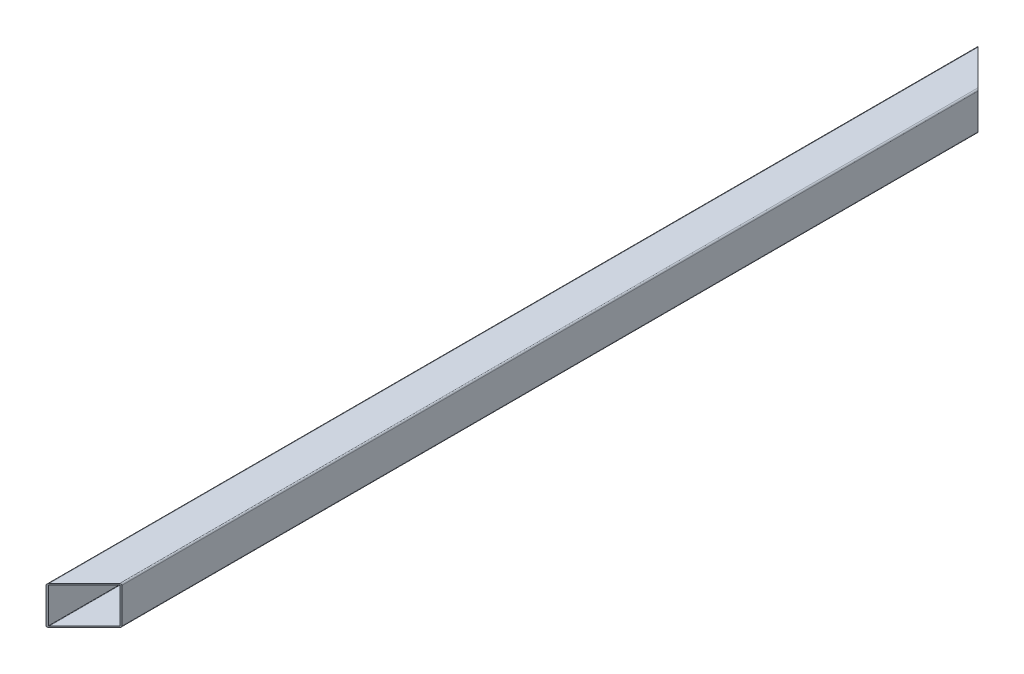
ISO-10303-21;
HEADER;
FILE_DESCRIPTION(('STEP AP214'),'2;1');
FILE_NAME('part.step','',(''),(''),'','','');
FILE_SCHEMA(('AUTOMOTIVE_DESIGN { 1 0 10303 214 1 1 1 1 }'));
ENDSEC;
DATA;
#1=APPLICATION_CONTEXT('core data for automotive mechanical design processes');
#2=APPLICATION_PROTOCOL_DEFINITION('international standard','automotive_design',2000,#1);
#3=PRODUCT_CONTEXT('',#1,'mechanical');
#4=PRODUCT('Part','Part','',(#3));
#5=PRODUCT_RELATED_PRODUCT_CATEGORY('part','',(#4));
#6=PRODUCT_DEFINITION_FORMATION('','',#4);
#7=PRODUCT_DEFINITION_CONTEXT('part definition',#1,'design');
#8=PRODUCT_DEFINITION('design','',#6,#7);
#9=PRODUCT_DEFINITION_SHAPE('','',#8);
#10=(LENGTH_UNIT() NAMED_UNIT(*) SI_UNIT(.MILLI.,.METRE.));
#11=(NAMED_UNIT(*) PLANE_ANGLE_UNIT() SI_UNIT($,.RADIAN.));
#12=(NAMED_UNIT(*) SI_UNIT($,.STERADIAN.) SOLID_ANGLE_UNIT());
#13=UNCERTAINTY_MEASURE_WITH_UNIT(LENGTH_MEASURE(1.E-05),#10,'distance_accuracy_value','');
#14=(GEOMETRIC_REPRESENTATION_CONTEXT(3) GLOBAL_UNCERTAINTY_ASSIGNED_CONTEXT((#13)) GLOBAL_UNIT_ASSIGNED_CONTEXT((#10,
#11,#12)) REPRESENTATION_CONTEXT('',''));
#15=CARTESIAN_POINT('',(0.,0.,0.));
#16=DIRECTION('',(0.,0.,1.));
#17=DIRECTION('',(1.,0.,0.));
#18=AXIS2_PLACEMENT_3D('',#15,#16,#17);
#19=CARTESIAN_POINT('',(-18.5,18.5,-980.));
#20=DIRECTION('',(0.,0.,1.));
#21=DIRECTION('',(1.,0.,0.));
#22=AXIS2_PLACEMENT_3D('',#19,#20,#21);
#23=CYLINDRICAL_SURFACE('',#22,1.5);
#24=DIRECTION('',(0.,0.,1.));
#25=VECTOR('',#24,1.);
#26=CARTESIAN_POINT('',(-20.,18.5,-980.));
#27=LINE('',#26,#25);
#28=CARTESIAN_POINT('',(-20.,18.5,-980.));
#29=VERTEX_POINT('',#28);
#30=CARTESIAN_POINT('',(-20.,18.5,0.));
#31=VERTEX_POINT('',#30);
#32=EDGE_CURVE('E231',#29,#31,#27,.T.);
#33=ORIENTED_EDGE('',*,*,#32,.T.);
#34=CARTESIAN_POINT('',(-18.5,18.5,-1.50000000000017));
#35=DIRECTION('',(-0.707106781186559,0.,-0.707106781186536));
#36=DIRECTION('',(-0.707106781186536,0.,0.707106781186559));
#37=AXIS2_PLACEMENT_3D('',#34,#35,#36);
#38=ELLIPSE('',#37,2.12132034355967,1.5);
#39=CARTESIAN_POINT('',(-18.4999999999999,20.,-1.50000000000016));
#40=VERTEX_POINT('',#39);
#41=EDGE_CURVE('E188',#31,#40,#38,.T.);
#42=ORIENTED_EDGE('',*,*,#41,.T.);
#43=DIRECTION('',(0.,0.,1.));
#44=VECTOR('',#43,1.);
#45=CARTESIAN_POINT('',(-18.5,20.,-980.));
#46=LINE('',#45,#44);
#47=CARTESIAN_POINT('',(-18.5,20.,-978.5));
#48=VERTEX_POINT('',#47);
#49=EDGE_CURVE('E12',#48,#40,#46,.T.);
#50=ORIENTED_EDGE('',*,*,#49,.F.);
#51=CARTESIAN_POINT('',(-18.5,18.5,-978.5));
#52=DIRECTION('',(-0.707106781186559,0.,0.707106781186536));
#53=DIRECTION('',(0.707106781186536,0.,0.707106781186559));
#54=AXIS2_PLACEMENT_3D('',#51,#52,#53);
#55=ELLIPSE('',#54,2.12132034355967,1.5);
#56=EDGE_CURVE('E298',#48,#29,#55,.T.);
#57=ORIENTED_EDGE('',*,*,#56,.T.);
#58=EDGE_LOOP('',(#33,#42,#50,#57));
#59=FACE_BOUND('',#58,.T.);
#60=ADVANCED_FACE('F63',(#59),#23,.T.);
#61=CARTESIAN_POINT('',(-18.5,20.,-980.));
#62=DIRECTION('',(0.,-1.,0.));
#63=DIRECTION('',(0.,0.,-1.));
#64=AXIS2_PLACEMENT_3D('',#61,#62,#63);
#65=PLANE('',#64);
#66=ORIENTED_EDGE('',*,*,#49,.T.);
#67=DIRECTION('',(-0.707106781186536,0.,0.707106781186559));
#68=VECTOR('',#67,1.);
#69=CARTESIAN_POINT('',(-20.,20.,0.));
#70=LINE('',#69,#68);
#71=CARTESIAN_POINT('',(18.5,20.,-38.5000000000012));
#72=VERTEX_POINT('',#71);
#73=EDGE_CURVE('E180',#72,#40,#70,.T.);
#74=ORIENTED_EDGE('',*,*,#73,.F.);
#75=DIRECTION('',(0.,0.,1.));
#76=VECTOR('',#75,1.);
#77=CARTESIAN_POINT('',(18.5,20.,-980.));
#78=LINE('',#77,#76);
#79=CARTESIAN_POINT('',(18.5,20.,-941.499999999999));
#80=VERTEX_POINT('',#79);
#81=EDGE_CURVE('E72',#80,#72,#78,.T.);
#82=ORIENTED_EDGE('',*,*,#81,.F.);
#83=DIRECTION('',(0.707106781186536,0.,0.707106781186559));
#84=VECTOR('',#83,1.);
#85=CARTESIAN_POINT('',(-20.,20.,-980.));
#86=LINE('',#85,#84);
#87=EDGE_CURVE('E272',#48,#80,#86,.T.);
#88=ORIENTED_EDGE('',*,*,#87,.F.);
#89=EDGE_LOOP('',(#66,#74,#82,#88));
#90=FACE_BOUND('',#89,.T.);
#91=ADVANCED_FACE('F192',(#90),#65,.F.);
#92=CARTESIAN_POINT('',(18.5,18.5,-980.));
#93=DIRECTION('',(0.,0.,1.));
#94=DIRECTION('',(1.,0.,0.));
#95=AXIS2_PLACEMENT_3D('',#92,#93,#94);
#96=CYLINDRICAL_SURFACE('',#95,1.5);
#97=ORIENTED_EDGE('',*,*,#81,.T.);
#98=CARTESIAN_POINT('',(18.5,18.5,-38.5000000000013));
#99=DIRECTION('',(-0.707106781186559,0.,-0.707106781186536));
#100=DIRECTION('',(-0.707106781186536,0.,0.707106781186559));
#101=AXIS2_PLACEMENT_3D('',#98,#99,#100);
#102=ELLIPSE('',#101,2.12132034355967,1.5);
#103=CARTESIAN_POINT('',(20.,18.5,-40.0000000000014));
#104=VERTEX_POINT('',#103);
#105=EDGE_CURVE('E177',#72,#104,#102,.T.);
#106=ORIENTED_EDGE('',*,*,#105,.T.);
#107=DIRECTION('',(0.,0.,1.));
#108=VECTOR('',#107,1.);
#109=CARTESIAN_POINT('',(20.,18.5,-980.));
#110=LINE('',#109,#108);
#111=CARTESIAN_POINT('',(20.,18.5,-939.999999999999));
#112=VERTEX_POINT('',#111);
#113=EDGE_CURVE('E200',#112,#104,#110,.T.);
#114=ORIENTED_EDGE('',*,*,#113,.F.);
#115=CARTESIAN_POINT('',(18.5,18.5,-941.499999999999));
#116=DIRECTION('',(-0.707106781186559,0.,0.707106781186536));
#117=DIRECTION('',(0.707106781186536,0.,0.707106781186559));
#118=AXIS2_PLACEMENT_3D('',#115,#116,#117);
#119=ELLIPSE('',#118,2.12132034355967,1.5);
#120=EDGE_CURVE('E199',#112,#80,#119,.T.);
#121=ORIENTED_EDGE('',*,*,#120,.T.);
#122=EDGE_LOOP('',(#97,#106,#114,#121));
#123=FACE_BOUND('',#122,.T.);
#124=ADVANCED_FACE('F198',(#123),#96,.T.);
#125=CARTESIAN_POINT('',(20.,-18.5,-980.));
#126=DIRECTION('',(-1.,0.,0.));
#127=DIRECTION('',(0.,0.,1.));
#128=AXIS2_PLACEMENT_3D('',#125,#126,#127);
#129=PLANE('',#128);
#130=ORIENTED_EDGE('',*,*,#113,.T.);
#131=DIRECTION('',(0.,-1.,0.));
#132=VECTOR('',#131,1.);
#133=CARTESIAN_POINT('',(20.,-18.5,-40.0000000000014));
#134=LINE('',#133,#132);
#135=CARTESIAN_POINT('',(20.,-18.5,-40.0000000000014));
#136=VERTEX_POINT('',#135);
#137=EDGE_CURVE('E183',#104,#136,#134,.T.);
#138=ORIENTED_EDGE('',*,*,#137,.T.);
#139=DIRECTION('',(0.,0.,1.));
#140=VECTOR('',#139,1.);
#141=CARTESIAN_POINT('',(20.,-18.5,-980.));
#142=LINE('',#141,#140);
#143=CARTESIAN_POINT('',(20.,-18.5,-939.999999999999));
#144=VERTEX_POINT('',#143);
#145=EDGE_CURVE('E202',#144,#136,#142,.T.);
#146=ORIENTED_EDGE('',*,*,#145,.F.);
#147=DIRECTION('',(0.,1.,0.));
#148=VECTOR('',#147,1.);
#149=CARTESIAN_POINT('',(20.,-18.5,-939.999999999999));
#150=LINE('',#149,#148);
#151=EDGE_CURVE('E265',#144,#112,#150,.T.);
#152=ORIENTED_EDGE('',*,*,#151,.T.);
#153=EDGE_LOOP('',(#130,#138,#146,#152));
#154=FACE_BOUND('',#153,.T.);
#155=ADVANCED_FACE('F264',(#154),#129,.F.);
#156=CARTESIAN_POINT('',(18.5,-18.5,-980.));
#157=DIRECTION('',(0.,0.,1.));
#158=DIRECTION('',(1.,0.,0.));
#159=AXIS2_PLACEMENT_3D('',#156,#157,#158);
#160=CYLINDRICAL_SURFACE('',#159,1.5);
#161=ORIENTED_EDGE('',*,*,#145,.T.);
#162=CARTESIAN_POINT('',(18.5,-18.5,-38.5000000000013));
#163=DIRECTION('',(-0.707106781186559,0.,-0.707106781186536));
#164=DIRECTION('',(-0.707106781186536,0.,0.707106781186559));
#165=AXIS2_PLACEMENT_3D('',#162,#163,#164);
#166=ELLIPSE('',#165,2.12132034355968,1.5);
#167=CARTESIAN_POINT('',(18.5,-20.,-38.5000000000013));
#168=VERTEX_POINT('',#167);
#169=EDGE_CURVE('E260',#136,#168,#166,.T.);
#170=ORIENTED_EDGE('',*,*,#169,.T.);
#171=DIRECTION('',(0.,0.,1.));
#172=VECTOR('',#171,1.);
#173=CARTESIAN_POINT('',(18.5,-20.,-980.));
#174=LINE('',#173,#172);
#175=CARTESIAN_POINT('',(18.5,-20.,-941.499999999999));
#176=VERTEX_POINT('',#175);
#177=EDGE_CURVE('E251',#176,#168,#174,.T.);
#178=ORIENTED_EDGE('',*,*,#177,.F.);
#179=CARTESIAN_POINT('',(18.5,-18.5,-941.499999999999));
#180=DIRECTION('',(-0.707106781186559,0.,0.707106781186536));
#181=DIRECTION('',(0.707106781186536,0.,0.707106781186559));
#182=AXIS2_PLACEMENT_3D('',#179,#180,#181);
#183=ELLIPSE('',#182,2.12132034355968,1.5);
#184=EDGE_CURVE('E261',#176,#144,#183,.T.);
#185=ORIENTED_EDGE('',*,*,#184,.T.);
#186=EDGE_LOOP('',(#161,#170,#178,#185));
#187=FACE_BOUND('',#186,.T.);
#188=ADVANCED_FACE('F258',(#187),#160,.T.);
#189=CARTESIAN_POINT('',(18.5,-20.,-980.));
#190=DIRECTION('',(0.,1.,0.));
#191=DIRECTION('',(0.,0.,1.));
#192=AXIS2_PLACEMENT_3D('',#189,#190,#191);
#193=PLANE('',#192);
#194=ORIENTED_EDGE('',*,*,#177,.T.);
#195=DIRECTION('',(-0.707106781186536,0.,0.707106781186559));
#196=VECTOR('',#195,1.);
#197=CARTESIAN_POINT('',(489.249999999999,-20.,-509.250000000016));
#198=LINE('',#197,#196);
#199=CARTESIAN_POINT('',(-18.5,-20.,-1.50000000000017));
#200=VERTEX_POINT('',#199);
#201=EDGE_CURVE('E267',#168,#200,#198,.T.);
#202=ORIENTED_EDGE('',*,*,#201,.T.);
#203=DIRECTION('',(0.,0.,1.));
#204=VECTOR('',#203,1.);
#205=CARTESIAN_POINT('',(-18.5,-20.,-980.));
#206=LINE('',#205,#204);
#207=CARTESIAN_POINT('',(-18.5,-20.,-978.5));
#208=VERTEX_POINT('',#207);
#209=EDGE_CURVE('E243',#208,#200,#206,.T.);
#210=ORIENTED_EDGE('',*,*,#209,.F.);
#211=DIRECTION('',(0.707106781186536,0.,0.707106781186559));
#212=VECTOR('',#211,1.);
#213=CARTESIAN_POINT('',(-0.750000000000615,-20.,-960.75));
#214=LINE('',#213,#212);
#215=EDGE_CURVE('E292',#208,#176,#214,.T.);
#216=ORIENTED_EDGE('',*,*,#215,.T.);
#217=EDGE_LOOP('',(#194,#202,#210,#216));
#218=FACE_BOUND('',#217,.T.);
#219=ADVANCED_FACE('F345',(#218),#193,.F.);
#220=CARTESIAN_POINT('',(-18.5,-18.5,-980.));
#221=DIRECTION('',(0.,0.,1.));
#222=DIRECTION('',(1.,0.,0.));
#223=AXIS2_PLACEMENT_3D('',#220,#221,#222);
#224=CYLINDRICAL_SURFACE('',#223,1.5);
#225=ORIENTED_EDGE('',*,*,#209,.T.);
#226=CARTESIAN_POINT('',(-18.5,-18.5,-1.50000000000017));
#227=DIRECTION('',(-0.707106781186559,0.,-0.707106781186536));
#228=DIRECTION('',(-0.707106781186536,0.,0.707106781186559));
#229=AXIS2_PLACEMENT_3D('',#226,#227,#228);
#230=ELLIPSE('',#229,2.12132034355968,1.5);
#231=CARTESIAN_POINT('',(-20.,-18.5,0.));
#232=VERTEX_POINT('',#231);
#233=EDGE_CURVE('E306',#200,#232,#230,.T.);
#234=ORIENTED_EDGE('',*,*,#233,.T.);
#235=DIRECTION('',(0.,0.,1.));
#236=VECTOR('',#235,1.);
#237=CARTESIAN_POINT('',(-20.,-18.5,-980.));
#238=LINE('',#237,#236);
#239=CARTESIAN_POINT('',(-20.,-18.5,-980.));
#240=VERTEX_POINT('',#239);
#241=EDGE_CURVE('E237',#240,#232,#238,.T.);
#242=ORIENTED_EDGE('',*,*,#241,.F.);
#243=CARTESIAN_POINT('',(-18.5,-18.5,-978.5));
#244=DIRECTION('',(-0.707106781186559,0.,0.707106781186536));
#245=DIRECTION('',(0.707106781186536,0.,0.707106781186559));
#246=AXIS2_PLACEMENT_3D('',#243,#244,#245);
#247=ELLIPSE('',#246,2.12132034355968,1.5);
#248=EDGE_CURVE('E289',#240,#208,#247,.T.);
#249=ORIENTED_EDGE('',*,*,#248,.T.);
#250=EDGE_LOOP('',(#225,#234,#242,#249));
#251=FACE_BOUND('',#250,.T.);
#252=ADVANCED_FACE('F309',(#251),#224,.T.);
#253=CARTESIAN_POINT('',(18.5,18.5,-980.));
#254=DIRECTION('',(0.,0.,1.));
#255=DIRECTION('',(1.,0.,0.));
#256=AXIS2_PLACEMENT_3D('',#253,#254,#255);
#257=CYLINDRICAL_SURFACE('',#256,0.3);
#258=CARTESIAN_POINT('',(18.5,18.5,-38.5000000000013));
#259=DIRECTION('',(-0.707106781186559,0.,-0.707106781186536));
#260=DIRECTION('',(-0.707106781186536,0.,0.707106781186559));
#261=AXIS2_PLACEMENT_3D('',#258,#259,#260);
#262=ELLIPSE('',#261,0.424264068711935,0.3);
#263=CARTESIAN_POINT('',(18.5,18.8,-38.5000000000014));
#264=VERTEX_POINT('',#263);
#265=CARTESIAN_POINT('',(18.8,18.5,-38.8000000000013));
#266=VERTEX_POINT('',#265);
#267=EDGE_CURVE('E80',#264,#266,#262,.T.);
#268=ORIENTED_EDGE('',*,*,#267,.F.);
#269=DIRECTION('',(0.,0.,1.));
#270=VECTOR('',#269,1.);
#271=CARTESIAN_POINT('',(18.5,18.8,-980.));
#272=LINE('',#271,#270);
#273=CARTESIAN_POINT('',(18.5,18.8,-941.499999999999));
#274=VERTEX_POINT('',#273);
#275=EDGE_CURVE('E67',#274,#264,#272,.T.);
#276=ORIENTED_EDGE('',*,*,#275,.F.);
#277=CARTESIAN_POINT('',(18.5,18.5,-941.499999999999));
#278=DIRECTION('',(-0.707106781186559,0.,0.707106781186536));
#279=DIRECTION('',(0.707106781186536,0.,0.707106781186559));
#280=AXIS2_PLACEMENT_3D('',#277,#278,#279);
#281=ELLIPSE('',#280,0.424264068711935,0.3);
#282=CARTESIAN_POINT('',(18.8,18.5,-941.199999999999));
#283=VERTEX_POINT('',#282);
#284=EDGE_CURVE('E287',#283,#274,#281,.T.);
#285=ORIENTED_EDGE('',*,*,#284,.F.);
#286=DIRECTION('',(0.,0.,1.));
#287=VECTOR('',#286,1.);
#288=CARTESIAN_POINT('',(18.8,18.5,-980.));
#289=LINE('',#288,#287);
#290=EDGE_CURVE('E206',#283,#266,#289,.T.);
#291=ORIENTED_EDGE('',*,*,#290,.T.);
#292=EDGE_LOOP('',(#268,#276,#285,#291));
#293=FACE_BOUND('',#292,.T.);
#294=ADVANCED_FACE('F65',(#293),#257,.F.);
#295=CARTESIAN_POINT('',(-18.5,18.8,-980.));
#296=DIRECTION('',(0.,-1.,0.));
#297=DIRECTION('',(0.,0.,-1.));
#298=AXIS2_PLACEMENT_3D('',#295,#296,#297);
#299=PLANE('',#298);
#300=DIRECTION('',(0.707106781186536,0.,-0.707106781186559));
#301=VECTOR('',#300,1.);
#302=CARTESIAN_POINT('',(470.75,18.8,-490.750000000016));
#303=LINE('',#302,#301);
#304=CARTESIAN_POINT('',(-18.5,18.8,-1.50000000000017));
#305=VERTEX_POINT('',#304);
#306=EDGE_CURVE('E312',#305,#264,#303,.T.);
#307=ORIENTED_EDGE('',*,*,#306,.F.);
#308=DIRECTION('',(0.,0.,1.));
#309=VECTOR('',#308,1.);
#310=CARTESIAN_POINT('',(-18.5,18.8,-980.));
#311=LINE('',#310,#309);
#312=CARTESIAN_POINT('',(-18.5,18.8,-978.5));
#313=VERTEX_POINT('',#312);
#314=EDGE_CURVE('E224',#313,#305,#311,.T.);
#315=ORIENTED_EDGE('',*,*,#314,.F.);
#316=DIRECTION('',(-0.707106781186536,0.,-0.707106781186559));
#317=VECTOR('',#316,1.);
#318=CARTESIAN_POINT('',(-19.25,18.8,-979.25));
#319=LINE('',#318,#317);
#320=EDGE_CURVE('E285',#274,#313,#319,.T.);
#321=ORIENTED_EDGE('',*,*,#320,.F.);
#322=ORIENTED_EDGE('',*,*,#275,.T.);
#323=EDGE_LOOP('',(#307,#315,#321,#322));
#324=FACE_BOUND('',#323,.T.);
#325=ADVANCED_FACE('F339',(#324),#299,.T.);
#326=CARTESIAN_POINT('',(-18.5,18.5,-980.));
#327=DIRECTION('',(0.,0.,1.));
#328=DIRECTION('',(1.,0.,0.));
#329=AXIS2_PLACEMENT_3D('',#326,#327,#328);
#330=CYLINDRICAL_SURFACE('',#329,0.3);
#331=CARTESIAN_POINT('',(-18.5,18.5,-1.50000000000017));
#332=DIRECTION('',(-0.707106781186559,0.,-0.707106781186536));
#333=DIRECTION('',(-0.707106781186536,0.,0.707106781186559));
#334=AXIS2_PLACEMENT_3D('',#331,#332,#333);
#335=ELLIPSE('',#334,0.424264068711935,0.3);
#336=CARTESIAN_POINT('',(-18.8,18.5,-1.20000000000009));
#337=VERTEX_POINT('',#336);
#338=EDGE_CURVE('E316',#337,#305,#335,.T.);
#339=ORIENTED_EDGE('',*,*,#338,.F.);
#340=DIRECTION('',(0.,0.,1.));
#341=VECTOR('',#340,1.);
#342=CARTESIAN_POINT('',(-18.8,18.5,-980.));
#343=LINE('',#342,#341);
#344=CARTESIAN_POINT('',(-18.8,18.5,-978.8));
#345=VERTEX_POINT('',#344);
#346=EDGE_CURVE('E222',#345,#337,#343,.T.);
#347=ORIENTED_EDGE('',*,*,#346,.F.);
#348=CARTESIAN_POINT('',(-18.5,18.5,-978.5));
#349=DIRECTION('',(-0.707106781186559,0.,0.707106781186536));
#350=DIRECTION('',(0.707106781186536,0.,0.707106781186559));
#351=AXIS2_PLACEMENT_3D('',#348,#349,#350);
#352=ELLIPSE('',#351,0.424264068711935,0.3);
#353=EDGE_CURVE('E283',#313,#345,#352,.T.);
#354=ORIENTED_EDGE('',*,*,#353,.F.);
#355=ORIENTED_EDGE('',*,*,#314,.T.);
#356=EDGE_LOOP('',(#339,#347,#354,#355));
#357=FACE_BOUND('',#356,.T.);
#358=ADVANCED_FACE('F344',(#357),#330,.F.);
#359=CARTESIAN_POINT('',(-18.8,18.5,-980.));
#360=DIRECTION('',(1.,0.,0.));
#361=DIRECTION('',(0.,0.,-1.));
#362=AXIS2_PLACEMENT_3D('',#359,#360,#361);
#363=PLANE('',#362);
#364=DIRECTION('',(0.,1.,0.));
#365=VECTOR('',#364,1.);
#366=CARTESIAN_POINT('',(-18.8,18.5,-1.20000000000009));
#367=LINE('',#366,#365);
#368=CARTESIAN_POINT('',(-18.8,-18.5,-1.20000000000009));
#369=VERTEX_POINT('',#368);
#370=EDGE_CURVE('E318',#369,#337,#367,.T.);
#371=ORIENTED_EDGE('',*,*,#370,.F.);
#372=DIRECTION('',(0.,0.,1.));
#373=VECTOR('',#372,1.);
#374=CARTESIAN_POINT('',(-18.8,-18.5,-980.));
#375=LINE('',#374,#373);
#376=CARTESIAN_POINT('',(-18.8,-18.5,-978.8));
#377=VERTEX_POINT('',#376);
#378=EDGE_CURVE('E219',#377,#369,#375,.T.);
#379=ORIENTED_EDGE('',*,*,#378,.F.);
#380=DIRECTION('',(0.,-1.,0.));
#381=VECTOR('',#380,1.);
#382=CARTESIAN_POINT('',(-18.8,18.5,-978.8));
#383=LINE('',#382,#381);
#384=EDGE_CURVE('E281',#345,#377,#383,.T.);
#385=ORIENTED_EDGE('',*,*,#384,.F.);
#386=ORIENTED_EDGE('',*,*,#346,.T.);
#387=EDGE_LOOP('',(#371,#379,#385,#386));
#388=FACE_BOUND('',#387,.T.);
#389=ADVANCED_FACE('F366',(#388),#363,.T.);
#390=CARTESIAN_POINT('',(-18.5,-18.5,-980.));
#391=DIRECTION('',(0.,0.,1.));
#392=DIRECTION('',(1.,0.,0.));
#393=AXIS2_PLACEMENT_3D('',#390,#391,#392);
#394=CYLINDRICAL_SURFACE('',#393,0.300000000000005);
#395=CARTESIAN_POINT('',(-18.5,-18.5,-1.50000000000017));
#396=DIRECTION('',(-0.707106781186559,0.,-0.707106781186536));
#397=DIRECTION('',(-0.707106781186536,0.,0.707106781186559));
#398=AXIS2_PLACEMENT_3D('',#395,#396,#397);
#399=ELLIPSE('',#398,0.424264068711943,0.300000000000005);
#400=CARTESIAN_POINT('',(-18.5000000000001,-18.8,-1.50000000000006));
#401=VERTEX_POINT('',#400);
#402=EDGE_CURVE('E320',#401,#369,#399,.T.);
#403=ORIENTED_EDGE('',*,*,#402,.F.);
#404=DIRECTION('',(0.,0.,1.));
#405=VECTOR('',#404,1.);
#406=CARTESIAN_POINT('',(-18.5,-18.8,-980.));
#407=LINE('',#406,#405);
#408=CARTESIAN_POINT('',(-18.5,-18.8,-978.5));
#409=VERTEX_POINT('',#408);
#410=EDGE_CURVE('E216',#409,#401,#407,.T.);
#411=ORIENTED_EDGE('',*,*,#410,.F.);
#412=CARTESIAN_POINT('',(-18.5,-18.5,-978.5));
#413=DIRECTION('',(-0.707106781186559,0.,0.707106781186536));
#414=DIRECTION('',(0.707106781186536,0.,0.707106781186559));
#415=AXIS2_PLACEMENT_3D('',#412,#413,#414);
#416=ELLIPSE('',#415,0.424264068711943,0.300000000000005);
#417=EDGE_CURVE('E279',#377,#409,#416,.T.);
#418=ORIENTED_EDGE('',*,*,#417,.F.);
#419=ORIENTED_EDGE('',*,*,#378,.T.);
#420=EDGE_LOOP('',(#403,#411,#418,#419));
#421=FACE_BOUND('',#420,.T.);
#422=ADVANCED_FACE('F362',(#421),#394,.F.);
#423=CARTESIAN_POINT('',(18.5,-18.8,-980.));
#424=DIRECTION('',(0.,1.,0.));
#425=DIRECTION('',(0.,0.,1.));
#426=AXIS2_PLACEMENT_3D('',#423,#424,#425);
#427=PLANE('',#426);
#428=DIRECTION('',(-0.707106781186536,0.,0.707106781186559));
#429=VECTOR('',#428,1.);
#430=CARTESIAN_POINT('',(489.249999999999,-18.8,-509.250000000016));
#431=LINE('',#430,#429);
#432=CARTESIAN_POINT('',(18.5,-18.8,-38.5000000000013));
#433=VERTEX_POINT('',#432);
#434=EDGE_CURVE('E322',#433,#401,#431,.T.);
#435=ORIENTED_EDGE('',*,*,#434,.F.);
#436=DIRECTION('',(0.,0.,1.));
#437=VECTOR('',#436,1.);
#438=CARTESIAN_POINT('',(18.5,-18.8,-980.));
#439=LINE('',#438,#437);
#440=CARTESIAN_POINT('',(18.5,-18.8,-941.499999999999));
#441=VERTEX_POINT('',#440);
#442=EDGE_CURVE('E213',#441,#433,#439,.T.);
#443=ORIENTED_EDGE('',*,*,#442,.F.);
#444=DIRECTION('',(0.707106781186536,0.,0.707106781186559));
#445=VECTOR('',#444,1.);
#446=CARTESIAN_POINT('',(-0.750000000000615,-18.8,-960.75));
#447=LINE('',#446,#445);
#448=EDGE_CURVE('E277',#409,#441,#447,.T.);
#449=ORIENTED_EDGE('',*,*,#448,.F.);
#450=ORIENTED_EDGE('',*,*,#410,.T.);
#451=EDGE_LOOP('',(#435,#443,#449,#450));
#452=FACE_BOUND('',#451,.T.);
#453=ADVANCED_FACE('F359',(#452),#427,.T.);
#454=CARTESIAN_POINT('',(18.5,-18.5,-980.));
#455=DIRECTION('',(0.,0.,1.));
#456=DIRECTION('',(1.,0.,0.));
#457=AXIS2_PLACEMENT_3D('',#454,#455,#456);
#458=CYLINDRICAL_SURFACE('',#457,0.300000000000003);
#459=CARTESIAN_POINT('',(18.5,-18.5,-38.5000000000013));
#460=DIRECTION('',(-0.707106781186559,0.,-0.707106781186536));
#461=DIRECTION('',(-0.707106781186536,0.,0.707106781186559));
#462=AXIS2_PLACEMENT_3D('',#459,#460,#461);
#463=ELLIPSE('',#462,0.42426406871194,0.300000000000003);
#464=CARTESIAN_POINT('',(18.8,-18.5,-38.8000000000013));
#465=VERTEX_POINT('',#464);
#466=EDGE_CURVE('E324',#465,#433,#463,.T.);
#467=ORIENTED_EDGE('',*,*,#466,.F.);
#468=DIRECTION('',(0.,0.,1.));
#469=VECTOR('',#468,1.);
#470=CARTESIAN_POINT('',(18.8,-18.5,-980.));
#471=LINE('',#470,#469);
#472=CARTESIAN_POINT('',(18.8,-18.5,-941.199999999999));
#473=VERTEX_POINT('',#472);
#474=EDGE_CURVE('E209',#473,#465,#471,.T.);
#475=ORIENTED_EDGE('',*,*,#474,.F.);
#476=CARTESIAN_POINT('',(18.5,-18.5,-941.499999999999));
#477=DIRECTION('',(-0.707106781186559,0.,0.707106781186536));
#478=DIRECTION('',(0.707106781186536,0.,0.707106781186559));
#479=AXIS2_PLACEMENT_3D('',#476,#477,#478);
#480=ELLIPSE('',#479,0.42426406871194,0.300000000000003);
#481=EDGE_CURVE('E88',#441,#473,#480,.T.);
#482=ORIENTED_EDGE('',*,*,#481,.F.);
#483=ORIENTED_EDGE('',*,*,#442,.T.);
#484=EDGE_LOOP('',(#467,#475,#482,#483));
#485=FACE_BOUND('',#484,.T.);
#486=ADVANCED_FACE('F332',(#485),#458,.F.);
#487=CARTESIAN_POINT('',(18.8,-18.5,-980.));
#488=DIRECTION('',(-1.,0.,0.));
#489=DIRECTION('',(0.,0.,1.));
#490=AXIS2_PLACEMENT_3D('',#487,#488,#489);
#491=PLANE('',#490);
#492=DIRECTION('',(0.,-1.,0.));
#493=VECTOR('',#492,1.);
#494=CARTESIAN_POINT('',(18.8,-18.5,-38.8000000000013));
#495=LINE('',#494,#493);
#496=EDGE_CURVE('E195',#266,#465,#495,.T.);
#497=ORIENTED_EDGE('',*,*,#496,.F.);
#498=ORIENTED_EDGE('',*,*,#290,.F.);
#499=DIRECTION('',(0.,1.,0.));
#500=VECTOR('',#499,1.);
#501=CARTESIAN_POINT('',(18.8,-18.5,-941.199999999999));
#502=LINE('',#501,#500);
#503=EDGE_CURVE('E274',#473,#283,#502,.T.);
#504=ORIENTED_EDGE('',*,*,#503,.F.);
#505=ORIENTED_EDGE('',*,*,#474,.T.);
#506=EDGE_LOOP('',(#497,#498,#504,#505));
#507=FACE_BOUND('',#506,.T.);
#508=ADVANCED_FACE('F334',(#507),#491,.T.);
#509=CARTESIAN_POINT('',(-20.,18.5,-980.));
#510=DIRECTION('',(1.,0.,0.));
#511=DIRECTION('',(0.,0.,-1.));
#512=AXIS2_PLACEMENT_3D('',#509,#510,#511);
#513=PLANE('',#512);
#514=DIRECTION('',(0.,1.,0.));
#515=VECTOR('',#514,1.);
#516=CARTESIAN_POINT('',(-20.,18.5,0.));
#517=LINE('',#516,#515);
#518=EDGE_CURVE('E246',#232,#31,#517,.T.);
#519=ORIENTED_EDGE('',*,*,#518,.T.);
#520=ORIENTED_EDGE('',*,*,#32,.F.);
#521=DIRECTION('',(0.,1.,0.));
#522=VECTOR('',#521,1.);
#523=CARTESIAN_POINT('',(-20.,18.5,-980.));
#524=LINE('',#523,#522);
#525=EDGE_CURVE('E210',#240,#29,#524,.T.);
#526=ORIENTED_EDGE('',*,*,#525,.F.);
#527=ORIENTED_EDGE('',*,*,#241,.T.);
#528=EDGE_LOOP('',(#519,#520,#526,#527));
#529=FACE_BOUND('',#528,.T.);
#530=ADVANCED_FACE('F303',(#529),#513,.F.);
#531=CARTESIAN_POINT('',(-20.,-30.,-980.));
#532=DIRECTION('',(-0.707106781186559,0.,0.707106781186536));
#533=DIRECTION('',(0.707106781186536,0.,0.707106781186559));
#534=AXIS2_PLACEMENT_3D('',#531,#532,#533);
#535=PLANE('',#534);
#536=ORIENTED_EDGE('',*,*,#284,.T.);
#537=ORIENTED_EDGE('',*,*,#320,.T.);
#538=ORIENTED_EDGE('',*,*,#353,.T.);
#539=ORIENTED_EDGE('',*,*,#384,.T.);
#540=ORIENTED_EDGE('',*,*,#417,.T.);
#541=ORIENTED_EDGE('',*,*,#448,.T.);
#542=ORIENTED_EDGE('',*,*,#481,.T.);
#543=ORIENTED_EDGE('',*,*,#503,.T.);
#544=EDGE_LOOP('',(#536,#537,#538,#539,#540,#541,#542,#543));
#545=FACE_BOUND('',#544,.T.);
#546=ORIENTED_EDGE('',*,*,#87,.T.);
#547=ORIENTED_EDGE('',*,*,#120,.F.);
#548=ORIENTED_EDGE('',*,*,#151,.F.);
#549=ORIENTED_EDGE('',*,*,#184,.F.);
#550=ORIENTED_EDGE('',*,*,#215,.F.);
#551=ORIENTED_EDGE('',*,*,#248,.F.);
#552=ORIENTED_EDGE('',*,*,#525,.T.);
#553=ORIENTED_EDGE('',*,*,#56,.F.);
#554=EDGE_LOOP('',(#546,#547,#548,#549,#550,#551,#552,#553));
#555=FACE_BOUND('',#554,.T.);
#556=ADVANCED_FACE('F336',(#545,#555),#535,.F.);
#557=CARTESIAN_POINT('',(-20.,-30.,0.));
#558=DIRECTION('',(-0.707106781186559,0.,-0.707106781186536));
#559=DIRECTION('',(-0.707106781186536,0.,0.707106781186559));
#560=AXIS2_PLACEMENT_3D('',#557,#558,#559);
#561=PLANE('',#560);
#562=ORIENTED_EDGE('',*,*,#267,.T.);
#563=ORIENTED_EDGE('',*,*,#496,.T.);
#564=ORIENTED_EDGE('',*,*,#466,.T.);
#565=ORIENTED_EDGE('',*,*,#434,.T.);
#566=ORIENTED_EDGE('',*,*,#402,.T.);
#567=ORIENTED_EDGE('',*,*,#370,.T.);
#568=ORIENTED_EDGE('',*,*,#338,.T.);
#569=ORIENTED_EDGE('',*,*,#306,.T.);
#570=EDGE_LOOP('',(#562,#563,#564,#565,#566,#567,#568,#569));
#571=FACE_BOUND('',#570,.T.);
#572=ORIENTED_EDGE('',*,*,#518,.F.);
#573=ORIENTED_EDGE('',*,*,#233,.F.);
#574=ORIENTED_EDGE('',*,*,#201,.F.);
#575=ORIENTED_EDGE('',*,*,#169,.F.);
#576=ORIENTED_EDGE('',*,*,#137,.F.);
#577=ORIENTED_EDGE('',*,*,#105,.F.);
#578=ORIENTED_EDGE('',*,*,#73,.T.);
#579=ORIENTED_EDGE('',*,*,#41,.F.);
#580=EDGE_LOOP('',(#572,#573,#574,#575,#576,#577,#578,#579));
#581=FACE_BOUND('',#580,.T.);
#582=ADVANCED_FACE('F179',(#571,#581),#561,.F.);
#583=CLOSED_SHELL('',(#60,#91,#124,#155,#188,#219,#252,#294,#325,#358,#389,#422,#453,#486,#508,
#530,#556,#582));
#584=MANIFOLD_SOLID_BREP('B2',#583);
#585=ADVANCED_BREP_SHAPE_REPRESENTATION('',(#18,#584),#14);
#586=SHAPE_DEFINITION_REPRESENTATION(#9,#585);
ENDSEC;
END-ISO-10303-21;
